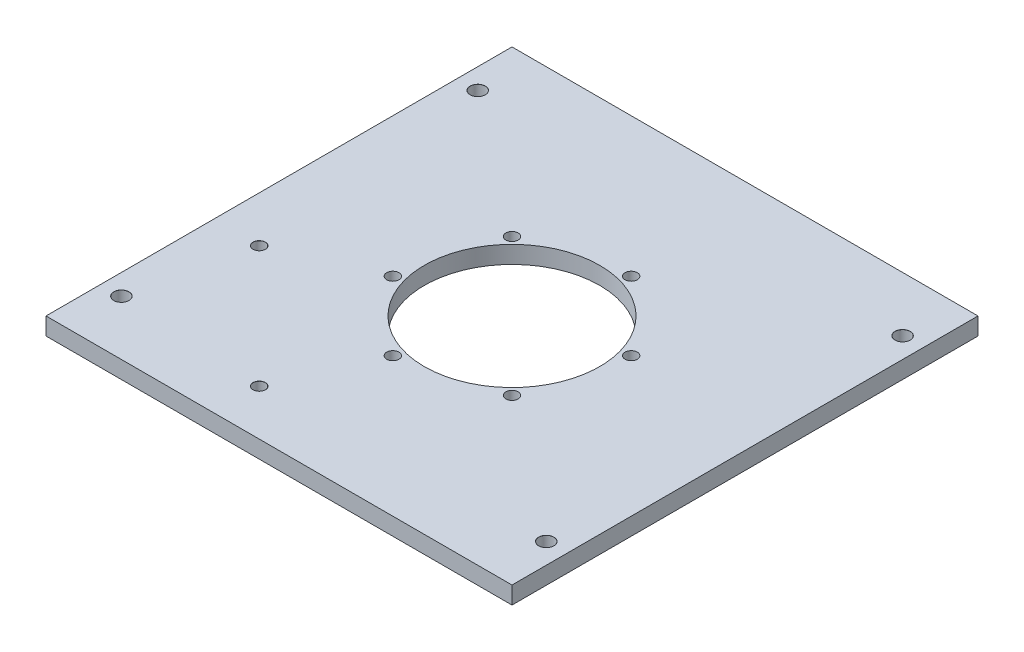
ISO-10303-21;
HEADER;
FILE_DESCRIPTION(('STEP AP214'),'2;1');
FILE_NAME('part.step','',(''),(''),'','','');
FILE_SCHEMA(('AUTOMOTIVE_DESIGN { 1 0 10303 214 1 1 1 1 }'));
ENDSEC;
DATA;
#1=APPLICATION_CONTEXT('core data for automotive mechanical design processes');
#2=APPLICATION_PROTOCOL_DEFINITION('international standard','automotive_design',2000,#1);
#3=PRODUCT_CONTEXT('',#1,'mechanical');
#4=PRODUCT('Part','Part','',(#3));
#5=PRODUCT_RELATED_PRODUCT_CATEGORY('part','',(#4));
#6=PRODUCT_DEFINITION_FORMATION('','',#4);
#7=PRODUCT_DEFINITION_CONTEXT('part definition',#1,'design');
#8=PRODUCT_DEFINITION('design','',#6,#7);
#9=PRODUCT_DEFINITION_SHAPE('','',#8);
#10=(LENGTH_UNIT() NAMED_UNIT(*) SI_UNIT(.MILLI.,.METRE.));
#11=(NAMED_UNIT(*) PLANE_ANGLE_UNIT() SI_UNIT($,.RADIAN.));
#12=(NAMED_UNIT(*) SI_UNIT($,.STERADIAN.) SOLID_ANGLE_UNIT());
#13=UNCERTAINTY_MEASURE_WITH_UNIT(LENGTH_MEASURE(1.E-05),#10,'distance_accuracy_value','');
#14=(GEOMETRIC_REPRESENTATION_CONTEXT(3) GLOBAL_UNCERTAINTY_ASSIGNED_CONTEXT((#13)) GLOBAL_UNIT_ASSIGNED_CONTEXT((#10,
#11,#12)) REPRESENTATION_CONTEXT('',''));
#15=CARTESIAN_POINT('',(0.,0.,0.));
#16=DIRECTION('',(0.,0.,1.));
#17=DIRECTION('',(1.,0.,0.));
#18=AXIS2_PLACEMENT_3D('',#15,#16,#17);
#19=CARTESIAN_POINT('',(0.,6.35,85.));
#20=DIRECTION('',(0.,0.,-1.));
#21=DIRECTION('',(-1.,0.,0.));
#22=AXIS2_PLACEMENT_3D('',#19,#20,#21);
#23=PLANE('',#22);
#24=DIRECTION('',(1.,0.,0.));
#25=VECTOR('',#24,1.);
#26=CARTESIAN_POINT('',(0.,0.,85.));
#27=LINE('',#26,#25);
#28=CARTESIAN_POINT('',(-85.,0.,85.));
#29=VERTEX_POINT('',#28);
#30=CARTESIAN_POINT('',(85.,0.,85.));
#31=VERTEX_POINT('',#30);
#32=EDGE_CURVE('E114',#29,#31,#27,.T.);
#33=ORIENTED_EDGE('',*,*,#32,.T.);
#34=DIRECTION('',(0.,-1.,0.));
#35=VECTOR('',#34,1.);
#36=CARTESIAN_POINT('',(85.,6.35,85.));
#37=LINE('',#36,#35);
#38=CARTESIAN_POINT('',(85.,6.35,85.));
#39=VERTEX_POINT('',#38);
#40=EDGE_CURVE('E11',#39,#31,#37,.T.);
#41=ORIENTED_EDGE('',*,*,#40,.F.);
#42=DIRECTION('',(1.,0.,0.));
#43=VECTOR('',#42,1.);
#44=CARTESIAN_POINT('',(0.,6.35,85.));
#45=LINE('',#44,#43);
#46=CARTESIAN_POINT('',(-85.,6.35,85.));
#47=VERTEX_POINT('',#46);
#48=EDGE_CURVE('E92',#47,#39,#45,.T.);
#49=ORIENTED_EDGE('',*,*,#48,.F.);
#50=DIRECTION('',(0.,-1.,0.));
#51=VECTOR('',#50,1.);
#52=CARTESIAN_POINT('',(-85.,6.35,85.));
#53=LINE('',#52,#51);
#54=EDGE_CURVE('E58',#47,#29,#53,.T.);
#55=ORIENTED_EDGE('',*,*,#54,.T.);
#56=EDGE_LOOP('',(#33,#41,#49,#55));
#57=FACE_BOUND('',#56,.T.);
#58=ADVANCED_FACE('F41',(#57),#23,.F.);
#59=CARTESIAN_POINT('',(85.,6.35,0.));
#60=DIRECTION('',(-1.,0.,0.));
#61=DIRECTION('',(0.,0.,1.));
#62=AXIS2_PLACEMENT_3D('',#59,#60,#61);
#63=PLANE('',#62);
#64=DIRECTION('',(0.,0.,-1.));
#65=VECTOR('',#64,1.);
#66=CARTESIAN_POINT('',(85.,0.,0.));
#67=LINE('',#66,#65);
#68=CARTESIAN_POINT('',(85.,0.,-85.));
#69=VERTEX_POINT('',#68);
#70=EDGE_CURVE('E98',#31,#69,#67,.T.);
#71=ORIENTED_EDGE('',*,*,#70,.T.);
#72=DIRECTION('',(0.,-1.,0.));
#73=VECTOR('',#72,1.);
#74=CARTESIAN_POINT('',(85.,6.35,-85.));
#75=LINE('',#74,#73);
#76=CARTESIAN_POINT('',(85.,6.35,-85.));
#77=VERTEX_POINT('',#76);
#78=EDGE_CURVE('E50',#77,#69,#75,.T.);
#79=ORIENTED_EDGE('',*,*,#78,.F.);
#80=DIRECTION('',(0.,0.,-1.));
#81=VECTOR('',#80,1.);
#82=CARTESIAN_POINT('',(85.,6.35,0.));
#83=LINE('',#82,#81);
#84=EDGE_CURVE('E83',#39,#77,#83,.T.);
#85=ORIENTED_EDGE('',*,*,#84,.F.);
#86=ORIENTED_EDGE('',*,*,#40,.T.);
#87=EDGE_LOOP('',(#71,#79,#85,#86));
#88=FACE_BOUND('',#87,.T.);
#89=ADVANCED_FACE('F97',(#88),#63,.F.);
#90=CARTESIAN_POINT('',(0.,6.35,-85.));
#91=DIRECTION('',(0.,0.,-1.));
#92=DIRECTION('',(-1.,0.,0.));
#93=AXIS2_PLACEMENT_3D('',#90,#91,#92);
#94=PLANE('',#93);
#95=DIRECTION('',(1.,0.,0.));
#96=VECTOR('',#95,1.);
#97=CARTESIAN_POINT('',(0.,0.,-85.));
#98=LINE('',#97,#96);
#99=CARTESIAN_POINT('',(-85.,0.,-85.));
#100=VERTEX_POINT('',#99);
#101=EDGE_CURVE('E120',#100,#69,#98,.T.);
#102=ORIENTED_EDGE('',*,*,#101,.F.);
#103=DIRECTION('',(0.,-1.,0.));
#104=VECTOR('',#103,1.);
#105=CARTESIAN_POINT('',(-85.,6.35,-85.));
#106=LINE('',#105,#104);
#107=CARTESIAN_POINT('',(-85.,6.35,-85.));
#108=VERTEX_POINT('',#107);
#109=EDGE_CURVE('E72',#108,#100,#106,.T.);
#110=ORIENTED_EDGE('',*,*,#109,.F.);
#111=DIRECTION('',(1.,0.,0.));
#112=VECTOR('',#111,1.);
#113=CARTESIAN_POINT('',(0.,6.35,-85.));
#114=LINE('',#113,#112);
#115=EDGE_CURVE('E91',#108,#77,#114,.T.);
#116=ORIENTED_EDGE('',*,*,#115,.T.);
#117=ORIENTED_EDGE('',*,*,#78,.T.);
#118=EDGE_LOOP('',(#102,#110,#116,#117));
#119=FACE_BOUND('',#118,.T.);
#120=ADVANCED_FACE('F102',(#119),#94,.T.);
#121=CARTESIAN_POINT('',(-85.,6.35,0.));
#122=DIRECTION('',(-1.,0.,0.));
#123=DIRECTION('',(0.,0.,1.));
#124=AXIS2_PLACEMENT_3D('',#121,#122,#123);
#125=PLANE('',#124);
#126=DIRECTION('',(0.,0.,-1.));
#127=VECTOR('',#126,1.);
#128=CARTESIAN_POINT('',(-85.,0.,0.));
#129=LINE('',#128,#127);
#130=EDGE_CURVE('E123',#29,#100,#129,.T.);
#131=ORIENTED_EDGE('',*,*,#130,.F.);
#132=ORIENTED_EDGE('',*,*,#54,.F.);
#133=DIRECTION('',(0.,0.,-1.));
#134=VECTOR('',#133,1.);
#135=CARTESIAN_POINT('',(-85.,6.35,0.));
#136=LINE('',#135,#134);
#137=EDGE_CURVE('E104',#47,#108,#136,.T.);
#138=ORIENTED_EDGE('',*,*,#137,.T.);
#139=ORIENTED_EDGE('',*,*,#109,.T.);
#140=EDGE_LOOP('',(#131,#132,#138,#139));
#141=FACE_BOUND('',#140,.T.);
#142=ADVANCED_FACE('F328',(#141),#125,.T.);
#143=CARTESIAN_POINT('',(0.,6.35,0.));
#144=DIRECTION('',(0.,-1.,0.));
#145=DIRECTION('',(0.,0.,-1.));
#146=AXIS2_PLACEMENT_3D('',#143,#144,#145);
#147=CYLINDRICAL_SURFACE('',#146,32.);
#148=CARTESIAN_POINT('',(0.,6.35,0.));
#149=DIRECTION('',(0.,1.,0.));
#150=DIRECTION('',(0.,0.,1.));
#151=AXIS2_PLACEMENT_3D('',#148,#149,#150);
#152=CIRCLE('',#151,32.);
#153=CARTESIAN_POINT('',(0.,6.35,32.));
#154=VERTEX_POINT('',#153);
#155=EDGE_CURVE('E107',#154,#154,#152,.T.);
#156=ORIENTED_EDGE('',*,*,#155,.T.);
#157=EDGE_LOOP('',(#156));
#158=FACE_BOUND('',#157,.T.);
#159=CARTESIAN_POINT('',(0.,0.,0.));
#160=DIRECTION('',(0.,1.,0.));
#161=DIRECTION('',(0.,0.,1.));
#162=AXIS2_PLACEMENT_3D('',#159,#160,#161);
#163=CIRCLE('',#162,32.);
#164=CARTESIAN_POINT('',(0.,0.,32.));
#165=VERTEX_POINT('',#164);
#166=EDGE_CURVE('E127',#165,#165,#163,.T.);
#167=ORIENTED_EDGE('',*,*,#166,.F.);
#168=EDGE_LOOP('',(#167));
#169=FACE_BOUND('',#168,.T.);
#170=ADVANCED_FACE('F287',(#158,#169),#147,.F.);
#171=CARTESIAN_POINT('',(0.,6.35,0.));
#172=DIRECTION('',(0.,1.,0.));
#173=DIRECTION('',(0.,0.,1.));
#174=AXIS2_PLACEMENT_3D('',#171,#172,#173);
#175=PLANE('',#174);
#176=CARTESIAN_POINT('',(-77.5,6.35,-65.));
#177=DIRECTION('',(0.,1.,0.));
#178=DIRECTION('',(0.,0.,1.));
#179=AXIS2_PLACEMENT_3D('',#176,#177,#178);
#180=CIRCLE('',#179,2.775);
#181=CARTESIAN_POINT('',(-77.5,6.35,-62.225));
#182=VERTEX_POINT('',#181);
#183=EDGE_CURVE('E277',#182,#182,#180,.T.);
#184=ORIENTED_EDGE('',*,*,#183,.F.);
#185=EDGE_LOOP('',(#184));
#186=FACE_BOUND('',#185,.T.);
#187=CARTESIAN_POINT('',(77.5,6.35,-65.));
#188=DIRECTION('',(0.,1.,0.));
#189=DIRECTION('',(0.,0.,1.));
#190=AXIS2_PLACEMENT_3D('',#187,#188,#189);
#191=CIRCLE('',#190,2.775);
#192=CARTESIAN_POINT('',(77.5,6.35,-62.225));
#193=VERTEX_POINT('',#192);
#194=EDGE_CURVE('E265',#193,#193,#191,.T.);
#195=ORIENTED_EDGE('',*,*,#194,.F.);
#196=EDGE_LOOP('',(#195));
#197=FACE_BOUND('',#196,.T.);
#198=CARTESIAN_POINT('',(77.5,6.35,65.));
#199=DIRECTION('',(0.,1.,0.));
#200=DIRECTION('',(0.,0.,1.));
#201=AXIS2_PLACEMENT_3D('',#198,#199,#200);
#202=CIRCLE('',#201,2.775);
#203=CARTESIAN_POINT('',(77.5,6.35,67.775));
#204=VERTEX_POINT('',#203);
#205=EDGE_CURVE('E253',#204,#204,#202,.T.);
#206=ORIENTED_EDGE('',*,*,#205,.F.);
#207=EDGE_LOOP('',(#206));
#208=FACE_BOUND('',#207,.T.);
#209=CARTESIAN_POINT('',(-77.5,6.35,65.));
#210=DIRECTION('',(0.,1.,0.));
#211=DIRECTION('',(0.,0.,1.));
#212=AXIS2_PLACEMENT_3D('',#209,#210,#211);
#213=CIRCLE('',#212,2.775);
#214=CARTESIAN_POINT('',(-77.5,6.35,67.775));
#215=VERTEX_POINT('',#214);
#216=EDGE_CURVE('E241',#215,#215,#213,.T.);
#217=ORIENTED_EDGE('',*,*,#216,.F.);
#218=EDGE_LOOP('',(#217));
#219=FACE_BOUND('',#218,.T.);
#220=CARTESIAN_POINT('',(-68.3016733622797,6.35,23.9165807072001));
#221=DIRECTION('',(0.,1.,0.));
#222=DIRECTION('',(0.,0.,1.));
#223=AXIS2_PLACEMENT_3D('',#220,#221,#222);
#224=CIRCLE('',#223,2.275);
#225=CARTESIAN_POINT('',(-68.3016733622797,6.35,26.1915807072001));
#226=VERTEX_POINT('',#225);
#227=EDGE_CURVE('E229',#226,#226,#224,.T.);
#228=ORIENTED_EDGE('',*,*,#227,.F.);
#229=EDGE_LOOP('',(#228));
#230=FACE_BOUND('',#229,.T.);
#231=CARTESIAN_POINT('',(-23.9165807072001,6.35,68.3016733622797));
#232=DIRECTION('',(0.,1.,0.));
#233=DIRECTION('',(0.,0.,1.));
#234=AXIS2_PLACEMENT_3D('',#231,#232,#233);
#235=CIRCLE('',#234,2.275);
#236=CARTESIAN_POINT('',(-23.9165807072001,6.35,70.5766733622797));
#237=VERTEX_POINT('',#236);
#238=EDGE_CURVE('E217',#237,#237,#235,.T.);
#239=ORIENTED_EDGE('',*,*,#238,.F.);
#240=EDGE_LOOP('',(#239));
#241=FACE_BOUND('',#240,.T.);
#242=CARTESIAN_POINT('',(9.18807610113908,6.35,-34.290366833262));
#243=DIRECTION('',(0.,-1.,0.));
#244=DIRECTION('',(0.,0.,-1.));
#245=AXIS2_PLACEMENT_3D('',#242,#243,#244);
#246=CIRCLE('',#245,2.25);
#247=CARTESIAN_POINT('',(9.18807610113908,6.35,-36.540366833262));
#248=VERTEX_POINT('',#247);
#249=EDGE_CURVE('E197',#248,#248,#246,.T.);
#250=ORIENTED_EDGE('',*,*,#249,.T.);
#251=EDGE_LOOP('',(#250));
#252=FACE_BOUND('',#251,.T.);
#253=CARTESIAN_POINT('',(-25.1022907321224,6.35,-25.1022907321224));
#254=DIRECTION('',(0.,-1.,0.));
#255=DIRECTION('',(0.,0.,-1.));
#256=AXIS2_PLACEMENT_3D('',#253,#254,#255);
#257=CIRCLE('',#256,2.25);
#258=CARTESIAN_POINT('',(-25.1022907321224,6.35,-27.3522907321224));
#259=VERTEX_POINT('',#258);
#260=EDGE_CURVE('E185',#259,#259,#257,.T.);
#261=ORIENTED_EDGE('',*,*,#260,.T.);
#262=EDGE_LOOP('',(#261));
#263=FACE_BOUND('',#262,.T.);
#264=CARTESIAN_POINT('',(-34.2903668332618,6.35,9.18807610114007));
#265=DIRECTION('',(0.,-1.,0.));
#266=DIRECTION('',(0.,0.,-1.));
#267=AXIS2_PLACEMENT_3D('',#264,#265,#266);
#268=CIRCLE('',#267,2.25);
#269=CARTESIAN_POINT('',(-34.2903668332618,6.35,6.93807610114007));
#270=VERTEX_POINT('',#269);
#271=EDGE_CURVE('E173',#270,#270,#268,.T.);
#272=ORIENTED_EDGE('',*,*,#271,.T.);
#273=EDGE_LOOP('',(#272));
#274=FACE_BOUND('',#273,.T.);
#275=CARTESIAN_POINT('',(-9.18807610113931,6.35,34.290366833262));
#276=DIRECTION('',(0.,-1.,0.));
#277=DIRECTION('',(0.,0.,-1.));
#278=AXIS2_PLACEMENT_3D('',#275,#276,#277);
#279=CIRCLE('',#278,2.25);
#280=CARTESIAN_POINT('',(-9.18807610113931,6.35,32.040366833262));
#281=VERTEX_POINT('',#280);
#282=EDGE_CURVE('E161',#281,#281,#279,.T.);
#283=ORIENTED_EDGE('',*,*,#282,.T.);
#284=EDGE_LOOP('',(#283));
#285=FACE_BOUND('',#284,.T.);
#286=CARTESIAN_POINT('',(25.1022907321224,6.35,25.1022907321224));
#287=DIRECTION('',(0.,-1.,0.));
#288=DIRECTION('',(0.,0.,-1.));
#289=AXIS2_PLACEMENT_3D('',#286,#287,#288);
#290=CIRCLE('',#289,2.25);
#291=CARTESIAN_POINT('',(25.1022907321224,6.35,22.8522907321224));
#292=VERTEX_POINT('',#291);
#293=EDGE_CURVE('E149',#292,#292,#290,.T.);
#294=ORIENTED_EDGE('',*,*,#293,.T.);
#295=EDGE_LOOP('',(#294));
#296=FACE_BOUND('',#295,.T.);
#297=CARTESIAN_POINT('',(34.2903668332619,6.35,-9.18807610113958));
#298=DIRECTION('',(0.,-1.,0.));
#299=DIRECTION('',(0.,0.,-1.));
#300=AXIS2_PLACEMENT_3D('',#297,#298,#299);
#301=CIRCLE('',#300,2.25);
#302=CARTESIAN_POINT('',(34.2903668332619,6.35,-11.4380761011396));
#303=VERTEX_POINT('',#302);
#304=EDGE_CURVE('E117',#303,#303,#301,.T.);
#305=ORIENTED_EDGE('',*,*,#304,.T.);
#306=EDGE_LOOP('',(#305));
#307=FACE_BOUND('',#306,.T.);
#308=ORIENTED_EDGE('',*,*,#48,.T.);
#309=ORIENTED_EDGE('',*,*,#84,.T.);
#310=ORIENTED_EDGE('',*,*,#115,.F.);
#311=ORIENTED_EDGE('',*,*,#137,.F.);
#312=EDGE_LOOP('',(#308,#309,#310,#311));
#313=FACE_BOUND('',#312,.T.);
#314=ORIENTED_EDGE('',*,*,#155,.F.);
#315=EDGE_LOOP('',(#314));
#316=FACE_BOUND('',#315,.T.);
#317=ADVANCED_FACE('F87',(#186,#197,#208,#219,#230,#241,#252,#263,#274,#285,#296,#307,#313,
#316),#175,.T.);
#318=CARTESIAN_POINT('',(0.,0.,0.));
#319=DIRECTION('',(0.,1.,0.));
#320=DIRECTION('',(0.,0.,1.));
#321=AXIS2_PLACEMENT_3D('',#318,#319,#320);
#322=PLANE('',#321);
#323=CARTESIAN_POINT('',(-77.5,0.,-65.));
#324=DIRECTION('',(0.,1.,0.));
#325=DIRECTION('',(0.,0.,1.));
#326=AXIS2_PLACEMENT_3D('',#323,#324,#325);
#327=CIRCLE('',#326,2.75);
#328=CARTESIAN_POINT('',(-77.5,0.,-62.25));
#329=VERTEX_POINT('',#328);
#330=EDGE_CURVE('E269',#329,#329,#327,.T.);
#331=ORIENTED_EDGE('',*,*,#330,.T.);
#332=EDGE_LOOP('',(#331));
#333=FACE_BOUND('',#332,.T.);
#334=CARTESIAN_POINT('',(77.5,0.,-65.));
#335=DIRECTION('',(0.,1.,0.));
#336=DIRECTION('',(0.,0.,1.));
#337=AXIS2_PLACEMENT_3D('',#334,#335,#336);
#338=CIRCLE('',#337,2.75);
#339=CARTESIAN_POINT('',(77.5,0.,-62.25));
#340=VERTEX_POINT('',#339);
#341=EDGE_CURVE('E257',#340,#340,#338,.T.);
#342=ORIENTED_EDGE('',*,*,#341,.T.);
#343=EDGE_LOOP('',(#342));
#344=FACE_BOUND('',#343,.T.);
#345=CARTESIAN_POINT('',(77.5,0.,65.));
#346=DIRECTION('',(0.,1.,0.));
#347=DIRECTION('',(0.,0.,1.));
#348=AXIS2_PLACEMENT_3D('',#345,#346,#347);
#349=CIRCLE('',#348,2.75);
#350=CARTESIAN_POINT('',(77.5,0.,67.75));
#351=VERTEX_POINT('',#350);
#352=EDGE_CURVE('E245',#351,#351,#349,.T.);
#353=ORIENTED_EDGE('',*,*,#352,.T.);
#354=EDGE_LOOP('',(#353));
#355=FACE_BOUND('',#354,.T.);
#356=CARTESIAN_POINT('',(-77.5,0.,65.));
#357=DIRECTION('',(0.,1.,0.));
#358=DIRECTION('',(0.,0.,1.));
#359=AXIS2_PLACEMENT_3D('',#356,#357,#358);
#360=CIRCLE('',#359,2.75);
#361=CARTESIAN_POINT('',(-77.5,0.,67.75));
#362=VERTEX_POINT('',#361);
#363=EDGE_CURVE('E233',#362,#362,#360,.T.);
#364=ORIENTED_EDGE('',*,*,#363,.T.);
#365=EDGE_LOOP('',(#364));
#366=FACE_BOUND('',#365,.T.);
#367=CARTESIAN_POINT('',(-68.3016733622797,0.,23.9165807072001));
#368=DIRECTION('',(0.,1.,0.));
#369=DIRECTION('',(0.,0.,1.));
#370=AXIS2_PLACEMENT_3D('',#367,#368,#369);
#371=CIRCLE('',#370,2.25);
#372=CARTESIAN_POINT('',(-68.3016733622797,0.,26.1665807072001));
#373=VERTEX_POINT('',#372);
#374=EDGE_CURVE('E221',#373,#373,#371,.T.);
#375=ORIENTED_EDGE('',*,*,#374,.T.);
#376=EDGE_LOOP('',(#375));
#377=FACE_BOUND('',#376,.T.);
#378=CARTESIAN_POINT('',(-23.9165807072001,0.,68.3016733622797));
#379=DIRECTION('',(0.,1.,0.));
#380=DIRECTION('',(0.,0.,1.));
#381=AXIS2_PLACEMENT_3D('',#378,#379,#380);
#382=CIRCLE('',#381,2.25);
#383=CARTESIAN_POINT('',(-23.9165807072001,0.,70.5516733622797));
#384=VERTEX_POINT('',#383);
#385=EDGE_CURVE('E209',#384,#384,#382,.T.);
#386=ORIENTED_EDGE('',*,*,#385,.T.);
#387=EDGE_LOOP('',(#386));
#388=FACE_BOUND('',#387,.T.);
#389=CARTESIAN_POINT('',(9.18807610113908,0.,-34.290366833262));
#390=DIRECTION('',(0.,-1.,0.));
#391=DIRECTION('',(0.,0.,-1.));
#392=AXIS2_PLACEMENT_3D('',#389,#390,#391);
#393=CIRCLE('',#392,2.275);
#394=CARTESIAN_POINT('',(9.18807610113908,0.,-36.565366833262));
#395=VERTEX_POINT('',#394);
#396=EDGE_CURVE('E205',#395,#395,#393,.T.);
#397=ORIENTED_EDGE('',*,*,#396,.F.);
#398=EDGE_LOOP('',(#397));
#399=FACE_BOUND('',#398,.T.);
#400=CARTESIAN_POINT('',(-25.1022907321224,0.,-25.1022907321224));
#401=DIRECTION('',(0.,-1.,0.));
#402=DIRECTION('',(0.,0.,-1.));
#403=AXIS2_PLACEMENT_3D('',#400,#401,#402);
#404=CIRCLE('',#403,2.275);
#405=CARTESIAN_POINT('',(-25.1022907321224,0.,-27.3772907321224));
#406=VERTEX_POINT('',#405);
#407=EDGE_CURVE('E193',#406,#406,#404,.T.);
#408=ORIENTED_EDGE('',*,*,#407,.F.);
#409=EDGE_LOOP('',(#408));
#410=FACE_BOUND('',#409,.T.);
#411=CARTESIAN_POINT('',(-34.2903668332618,0.,9.18807610114007));
#412=DIRECTION('',(0.,-1.,0.));
#413=DIRECTION('',(0.,0.,-1.));
#414=AXIS2_PLACEMENT_3D('',#411,#412,#413);
#415=CIRCLE('',#414,2.275);
#416=CARTESIAN_POINT('',(-34.2903668332618,0.,6.91307610114007));
#417=VERTEX_POINT('',#416);
#418=EDGE_CURVE('E181',#417,#417,#415,.T.);
#419=ORIENTED_EDGE('',*,*,#418,.F.);
#420=EDGE_LOOP('',(#419));
#421=FACE_BOUND('',#420,.T.);
#422=CARTESIAN_POINT('',(-9.18807610113931,0.,34.290366833262));
#423=DIRECTION('',(0.,-1.,0.));
#424=DIRECTION('',(0.,0.,-1.));
#425=AXIS2_PLACEMENT_3D('',#422,#423,#424);
#426=CIRCLE('',#425,2.275);
#427=CARTESIAN_POINT('',(-9.18807610113931,0.,32.015366833262));
#428=VERTEX_POINT('',#427);
#429=EDGE_CURVE('E169',#428,#428,#426,.T.);
#430=ORIENTED_EDGE('',*,*,#429,.F.);
#431=EDGE_LOOP('',(#430));
#432=FACE_BOUND('',#431,.T.);
#433=CARTESIAN_POINT('',(25.1022907321224,0.,25.1022907321224));
#434=DIRECTION('',(0.,-1.,0.));
#435=DIRECTION('',(0.,0.,-1.));
#436=AXIS2_PLACEMENT_3D('',#433,#434,#435);
#437=CIRCLE('',#436,2.275);
#438=CARTESIAN_POINT('',(25.1022907321224,0.,22.8272907321224));
#439=VERTEX_POINT('',#438);
#440=EDGE_CURVE('E157',#439,#439,#437,.T.);
#441=ORIENTED_EDGE('',*,*,#440,.F.);
#442=EDGE_LOOP('',(#441));
#443=FACE_BOUND('',#442,.T.);
#444=CARTESIAN_POINT('',(34.2903668332619,0.,-9.18807610113958));
#445=DIRECTION('',(0.,-1.,0.));
#446=DIRECTION('',(0.,0.,-1.));
#447=AXIS2_PLACEMENT_3D('',#444,#445,#446);
#448=CIRCLE('',#447,2.275);
#449=CARTESIAN_POINT('',(34.2903668332619,0.,-11.4630761011396));
#450=VERTEX_POINT('',#449);
#451=EDGE_CURVE('E145',#450,#450,#448,.T.);
#452=ORIENTED_EDGE('',*,*,#451,.F.);
#453=EDGE_LOOP('',(#452));
#454=FACE_BOUND('',#453,.T.);
#455=ORIENTED_EDGE('',*,*,#32,.F.);
#456=ORIENTED_EDGE('',*,*,#130,.T.);
#457=ORIENTED_EDGE('',*,*,#101,.T.);
#458=ORIENTED_EDGE('',*,*,#70,.F.);
#459=EDGE_LOOP('',(#455,#456,#457,#458));
#460=FACE_BOUND('',#459,.T.);
#461=ORIENTED_EDGE('',*,*,#166,.T.);
#462=EDGE_LOOP('',(#461));
#463=FACE_BOUND('',#462,.T.);
#464=ADVANCED_FACE('F286',(#333,#344,#355,#366,#377,#388,#399,#410,#421,#432,#443,#454,#460,
#463),#322,.F.);
#465=CARTESIAN_POINT('',(34.2903668332619,0.,-9.18807610113958));
#466=DIRECTION('',(0.,-1.,0.));
#467=DIRECTION('',(0.,0.,-1.));
#468=AXIS2_PLACEMENT_3D('',#465,#466,#467);
#469=CYLINDRICAL_SURFACE('',#468,2.25);
#470=ORIENTED_EDGE('',*,*,#304,.F.);
#471=EDGE_LOOP('',(#470));
#472=FACE_BOUND('',#471,.T.);
#473=CARTESIAN_POINT('',(34.2903668332619,0.0249999999999972,-9.18807610113958));
#474=DIRECTION('',(0.,-1.,0.));
#475=DIRECTION('',(0.,0.,-1.));
#476=AXIS2_PLACEMENT_3D('',#473,#474,#475);
#477=CIRCLE('',#476,2.24999999999999);
#478=CARTESIAN_POINT('',(34.2903668332619,0.0249999999999972,-11.4380761011396));
#479=VERTEX_POINT('',#478);
#480=EDGE_CURVE('E141',#479,#479,#477,.T.);
#481=ORIENTED_EDGE('',*,*,#480,.T.);
#482=EDGE_LOOP('',(#481));
#483=FACE_BOUND('',#482,.T.);
#484=ADVANCED_FACE('F311',(#472,#483),#469,.F.);
#485=CARTESIAN_POINT('',(34.2903668332619,0.,-9.18807610113958));
#486=DIRECTION('',(0.,-1.,0.));
#487=DIRECTION('',(0.,0.,-1.));
#488=AXIS2_PLACEMENT_3D('',#485,#486,#487);
#489=CONICAL_SURFACE('',#488,2.275,0.785398163397691);
#490=ORIENTED_EDGE('',*,*,#480,.F.);
#491=EDGE_LOOP('',(#490));
#492=FACE_BOUND('',#491,.T.);
#493=ORIENTED_EDGE('',*,*,#451,.T.);
#494=EDGE_LOOP('',(#493));
#495=FACE_BOUND('',#494,.T.);
#496=ADVANCED_FACE('F314',(#492,#495),#489,.F.);
#497=CARTESIAN_POINT('',(25.1022907321224,0.,25.1022907321224));
#498=DIRECTION('',(0.,-1.,0.));
#499=DIRECTION('',(0.,0.,-1.));
#500=AXIS2_PLACEMENT_3D('',#497,#498,#499);
#501=CYLINDRICAL_SURFACE('',#500,2.24999999999999);
#502=ORIENTED_EDGE('',*,*,#293,.F.);
#503=EDGE_LOOP('',(#502));
#504=FACE_BOUND('',#503,.T.);
#505=CARTESIAN_POINT('',(25.1022907321224,0.0249999999999972,25.1022907321224));
#506=DIRECTION('',(0.,-1.,0.));
#507=DIRECTION('',(0.,0.,-1.));
#508=AXIS2_PLACEMENT_3D('',#505,#506,#507);
#509=CIRCLE('',#508,2.24999999999999);
#510=CARTESIAN_POINT('',(25.1022907321224,0.0249999999999972,22.8522907321224));
#511=VERTEX_POINT('',#510);
#512=EDGE_CURVE('E153',#511,#511,#509,.T.);
#513=ORIENTED_EDGE('',*,*,#512,.T.);
#514=EDGE_LOOP('',(#513));
#515=FACE_BOUND('',#514,.T.);
#516=ADVANCED_FACE('F320',(#504,#515),#501,.F.);
#517=CARTESIAN_POINT('',(25.1022907321224,0.,25.1022907321224));
#518=DIRECTION('',(0.,-1.,0.));
#519=DIRECTION('',(0.,0.,-1.));
#520=AXIS2_PLACEMENT_3D('',#517,#518,#519);
#521=CONICAL_SURFACE('',#520,2.275,0.785398163397691);
#522=ORIENTED_EDGE('',*,*,#512,.F.);
#523=EDGE_LOOP('',(#522));
#524=FACE_BOUND('',#523,.T.);
#525=ORIENTED_EDGE('',*,*,#440,.T.);
#526=EDGE_LOOP('',(#525));
#527=FACE_BOUND('',#526,.T.);
#528=ADVANCED_FACE('F381',(#524,#527),#521,.F.);
#529=CARTESIAN_POINT('',(-9.18807610113931,0.,34.290366833262));
#530=DIRECTION('',(0.,-1.,0.));
#531=DIRECTION('',(0.,0.,-1.));
#532=AXIS2_PLACEMENT_3D('',#529,#530,#531);
#533=CYLINDRICAL_SURFACE('',#532,2.24999999999999);
#534=ORIENTED_EDGE('',*,*,#282,.F.);
#535=EDGE_LOOP('',(#534));
#536=FACE_BOUND('',#535,.T.);
#537=CARTESIAN_POINT('',(-9.18807610113931,0.0249999999999972,34.290366833262));
#538=DIRECTION('',(0.,-1.,0.));
#539=DIRECTION('',(0.,0.,-1.));
#540=AXIS2_PLACEMENT_3D('',#537,#538,#539);
#541=CIRCLE('',#540,2.24999999999999);
#542=CARTESIAN_POINT('',(-9.18807610113931,0.0249999999999972,32.040366833262));
#543=VERTEX_POINT('',#542);
#544=EDGE_CURVE('E165',#543,#543,#541,.T.);
#545=ORIENTED_EDGE('',*,*,#544,.T.);
#546=EDGE_LOOP('',(#545));
#547=FACE_BOUND('',#546,.T.);
#548=ADVANCED_FACE('F391',(#536,#547),#533,.F.);
#549=CARTESIAN_POINT('',(-9.18807610113931,0.,34.290366833262));
#550=DIRECTION('',(0.,-1.,0.));
#551=DIRECTION('',(0.,0.,-1.));
#552=AXIS2_PLACEMENT_3D('',#549,#550,#551);
#553=CONICAL_SURFACE('',#552,2.275,0.785398163397691);
#554=ORIENTED_EDGE('',*,*,#544,.F.);
#555=EDGE_LOOP('',(#554));
#556=FACE_BOUND('',#555,.T.);
#557=ORIENTED_EDGE('',*,*,#429,.T.);
#558=EDGE_LOOP('',(#557));
#559=FACE_BOUND('',#558,.T.);
#560=ADVANCED_FACE('F401',(#556,#559),#553,.F.);
#561=CARTESIAN_POINT('',(-34.2903668332618,0.,9.18807610114007));
#562=DIRECTION('',(0.,-1.,0.));
#563=DIRECTION('',(0.,0.,-1.));
#564=AXIS2_PLACEMENT_3D('',#561,#562,#563);
#565=CYLINDRICAL_SURFACE('',#564,2.25);
#566=ORIENTED_EDGE('',*,*,#271,.F.);
#567=EDGE_LOOP('',(#566));
#568=FACE_BOUND('',#567,.T.);
#569=CARTESIAN_POINT('',(-34.2903668332618,0.0249999999999972,9.18807610114007));
#570=DIRECTION('',(0.,-1.,0.));
#571=DIRECTION('',(0.,0.,-1.));
#572=AXIS2_PLACEMENT_3D('',#569,#570,#571);
#573=CIRCLE('',#572,2.24999999999999);
#574=CARTESIAN_POINT('',(-34.2903668332618,0.0249999999999972,6.93807610114008));
#575=VERTEX_POINT('',#574);
#576=EDGE_CURVE('E177',#575,#575,#573,.T.);
#577=ORIENTED_EDGE('',*,*,#576,.T.);
#578=EDGE_LOOP('',(#577));
#579=FACE_BOUND('',#578,.T.);
#580=ADVANCED_FACE('F411',(#568,#579),#565,.F.);
#581=CARTESIAN_POINT('',(-34.2903668332618,0.,9.18807610114007));
#582=DIRECTION('',(0.,-1.,0.));
#583=DIRECTION('',(0.,0.,-1.));
#584=AXIS2_PLACEMENT_3D('',#581,#582,#583);
#585=CONICAL_SURFACE('',#584,2.275,0.785398163397691);
#586=ORIENTED_EDGE('',*,*,#576,.F.);
#587=EDGE_LOOP('',(#586));
#588=FACE_BOUND('',#587,.T.);
#589=ORIENTED_EDGE('',*,*,#418,.T.);
#590=EDGE_LOOP('',(#589));
#591=FACE_BOUND('',#590,.T.);
#592=ADVANCED_FACE('F421',(#588,#591),#585,.F.);
#593=CARTESIAN_POINT('',(-25.1022907321224,0.,-25.1022907321224));
#594=DIRECTION('',(0.,-1.,0.));
#595=DIRECTION('',(0.,0.,-1.));
#596=AXIS2_PLACEMENT_3D('',#593,#594,#595);
#597=CYLINDRICAL_SURFACE('',#596,2.24999999999999);
#598=ORIENTED_EDGE('',*,*,#260,.F.);
#599=EDGE_LOOP('',(#598));
#600=FACE_BOUND('',#599,.T.);
#601=CARTESIAN_POINT('',(-25.1022907321224,0.0249999999999972,-25.1022907321224));
#602=DIRECTION('',(0.,-1.,0.));
#603=DIRECTION('',(0.,0.,-1.));
#604=AXIS2_PLACEMENT_3D('',#601,#602,#603);
#605=CIRCLE('',#604,2.24999999999999);
#606=CARTESIAN_POINT('',(-25.1022907321224,0.0249999999999972,-27.3522907321224));
#607=VERTEX_POINT('',#606);
#608=EDGE_CURVE('E189',#607,#607,#605,.T.);
#609=ORIENTED_EDGE('',*,*,#608,.T.);
#610=EDGE_LOOP('',(#609));
#611=FACE_BOUND('',#610,.T.);
#612=ADVANCED_FACE('F431',(#600,#611),#597,.F.);
#613=CARTESIAN_POINT('',(-25.1022907321224,0.,-25.1022907321224));
#614=DIRECTION('',(0.,-1.,0.));
#615=DIRECTION('',(0.,0.,-1.));
#616=AXIS2_PLACEMENT_3D('',#613,#614,#615);
#617=CONICAL_SURFACE('',#616,2.275,0.785398163397691);
#618=ORIENTED_EDGE('',*,*,#608,.F.);
#619=EDGE_LOOP('',(#618));
#620=FACE_BOUND('',#619,.T.);
#621=ORIENTED_EDGE('',*,*,#407,.T.);
#622=EDGE_LOOP('',(#621));
#623=FACE_BOUND('',#622,.T.);
#624=ADVANCED_FACE('F441',(#620,#623),#617,.F.);
#625=CARTESIAN_POINT('',(9.18807610113908,0.,-34.290366833262));
#626=DIRECTION('',(0.,-1.,0.));
#627=DIRECTION('',(0.,0.,-1.));
#628=AXIS2_PLACEMENT_3D('',#625,#626,#627);
#629=CYLINDRICAL_SURFACE('',#628,2.24999999999999);
#630=ORIENTED_EDGE('',*,*,#249,.F.);
#631=EDGE_LOOP('',(#630));
#632=FACE_BOUND('',#631,.T.);
#633=CARTESIAN_POINT('',(9.18807610113908,0.0249999999999972,-34.290366833262));
#634=DIRECTION('',(0.,-1.,0.));
#635=DIRECTION('',(0.,0.,-1.));
#636=AXIS2_PLACEMENT_3D('',#633,#634,#635);
#637=CIRCLE('',#636,2.24999999999999);
#638=CARTESIAN_POINT('',(9.18807610113908,0.0249999999999972,-36.540366833262));
#639=VERTEX_POINT('',#638);
#640=EDGE_CURVE('E201',#639,#639,#637,.T.);
#641=ORIENTED_EDGE('',*,*,#640,.T.);
#642=EDGE_LOOP('',(#641));
#643=FACE_BOUND('',#642,.T.);
#644=ADVANCED_FACE('F451',(#632,#643),#629,.F.);
#645=CARTESIAN_POINT('',(9.18807610113908,0.,-34.290366833262));
#646=DIRECTION('',(0.,-1.,0.));
#647=DIRECTION('',(0.,0.,-1.));
#648=AXIS2_PLACEMENT_3D('',#645,#646,#647);
#649=CONICAL_SURFACE('',#648,2.275,0.785398163397691);
#650=ORIENTED_EDGE('',*,*,#640,.F.);
#651=EDGE_LOOP('',(#650));
#652=FACE_BOUND('',#651,.T.);
#653=ORIENTED_EDGE('',*,*,#396,.T.);
#654=EDGE_LOOP('',(#653));
#655=FACE_BOUND('',#654,.T.);
#656=ADVANCED_FACE('F461',(#652,#655),#649,.F.);
#657=CARTESIAN_POINT('',(-23.9165807072001,6.35,68.3016733622797));
#658=DIRECTION('',(0.,1.,0.));
#659=DIRECTION('',(0.,0.,1.));
#660=AXIS2_PLACEMENT_3D('',#657,#658,#659);
#661=CYLINDRICAL_SURFACE('',#660,2.24999999999999);
#662=ORIENTED_EDGE('',*,*,#385,.F.);
#663=EDGE_LOOP('',(#662));
#664=FACE_BOUND('',#663,.T.);
#665=CARTESIAN_POINT('',(-23.9165807072001,6.325,68.3016733622797));
#666=DIRECTION('',(0.,1.,0.));
#667=DIRECTION('',(0.,0.,1.));
#668=AXIS2_PLACEMENT_3D('',#665,#666,#667);
#669=CIRCLE('',#668,2.24999999999999);
#670=CARTESIAN_POINT('',(-23.9165807072001,6.325,70.5516733622797));
#671=VERTEX_POINT('',#670);
#672=EDGE_CURVE('E213',#671,#671,#669,.T.);
#673=ORIENTED_EDGE('',*,*,#672,.T.);
#674=EDGE_LOOP('',(#673));
#675=FACE_BOUND('',#674,.T.);
#676=ADVANCED_FACE('F471',(#664,#675),#661,.F.);
#677=CARTESIAN_POINT('',(-23.9165807072001,6.35,68.3016733622797));
#678=DIRECTION('',(0.,1.,0.));
#679=DIRECTION('',(0.,0.,1.));
#680=AXIS2_PLACEMENT_3D('',#677,#678,#679);
#681=CONICAL_SURFACE('',#680,2.275,0.785398163397691);
#682=ORIENTED_EDGE('',*,*,#672,.F.);
#683=EDGE_LOOP('',(#682));
#684=FACE_BOUND('',#683,.T.);
#685=ORIENTED_EDGE('',*,*,#238,.T.);
#686=EDGE_LOOP('',(#685));
#687=FACE_BOUND('',#686,.T.);
#688=ADVANCED_FACE('F481',(#684,#687),#681,.F.);
#689=CARTESIAN_POINT('',(-68.3016733622797,6.35,23.9165807072001));
#690=DIRECTION('',(0.,1.,0.));
#691=DIRECTION('',(0.,0.,1.));
#692=AXIS2_PLACEMENT_3D('',#689,#690,#691);
#693=CYLINDRICAL_SURFACE('',#692,2.25);
#694=ORIENTED_EDGE('',*,*,#374,.F.);
#695=EDGE_LOOP('',(#694));
#696=FACE_BOUND('',#695,.T.);
#697=CARTESIAN_POINT('',(-68.3016733622797,6.325,23.9165807072001));
#698=DIRECTION('',(0.,1.,0.));
#699=DIRECTION('',(0.,0.,1.));
#700=AXIS2_PLACEMENT_3D('',#697,#698,#699);
#701=CIRCLE('',#700,2.24999999999999);
#702=CARTESIAN_POINT('',(-68.3016733622797,6.325,26.1665807072001));
#703=VERTEX_POINT('',#702);
#704=EDGE_CURVE('E225',#703,#703,#701,.T.);
#705=ORIENTED_EDGE('',*,*,#704,.T.);
#706=EDGE_LOOP('',(#705));
#707=FACE_BOUND('',#706,.T.);
#708=ADVANCED_FACE('F491',(#696,#707),#693,.F.);
#709=CARTESIAN_POINT('',(-68.3016733622797,6.35,23.9165807072001));
#710=DIRECTION('',(0.,1.,0.));
#711=DIRECTION('',(0.,0.,1.));
#712=AXIS2_PLACEMENT_3D('',#709,#710,#711);
#713=CONICAL_SURFACE('',#712,2.275,0.785398163397691);
#714=ORIENTED_EDGE('',*,*,#704,.F.);
#715=EDGE_LOOP('',(#714));
#716=FACE_BOUND('',#715,.T.);
#717=ORIENTED_EDGE('',*,*,#227,.T.);
#718=EDGE_LOOP('',(#717));
#719=FACE_BOUND('',#718,.T.);
#720=ADVANCED_FACE('F501',(#716,#719),#713,.F.);
#721=CARTESIAN_POINT('',(-77.5,6.35,65.));
#722=DIRECTION('',(0.,1.,0.));
#723=DIRECTION('',(0.,0.,1.));
#724=AXIS2_PLACEMENT_3D('',#721,#722,#723);
#725=CYLINDRICAL_SURFACE('',#724,2.75);
#726=ORIENTED_EDGE('',*,*,#363,.F.);
#727=EDGE_LOOP('',(#726));
#728=FACE_BOUND('',#727,.T.);
#729=CARTESIAN_POINT('',(-77.5,6.325,65.));
#730=DIRECTION('',(0.,1.,0.));
#731=DIRECTION('',(0.,0.,1.));
#732=AXIS2_PLACEMENT_3D('',#729,#730,#731);
#733=CIRCLE('',#732,2.74999999999999);
#734=CARTESIAN_POINT('',(-77.5,6.325,67.75));
#735=VERTEX_POINT('',#734);
#736=EDGE_CURVE('E237',#735,#735,#733,.T.);
#737=ORIENTED_EDGE('',*,*,#736,.T.);
#738=EDGE_LOOP('',(#737));
#739=FACE_BOUND('',#738,.T.);
#740=ADVANCED_FACE('F511',(#728,#739),#725,.F.);
#741=CARTESIAN_POINT('',(-77.5,6.35,65.));
#742=DIRECTION('',(0.,1.,0.));
#743=DIRECTION('',(0.,0.,1.));
#744=AXIS2_PLACEMENT_3D('',#741,#742,#743);
#745=CONICAL_SURFACE('',#744,2.775,0.785398163397691);
#746=ORIENTED_EDGE('',*,*,#736,.F.);
#747=EDGE_LOOP('',(#746));
#748=FACE_BOUND('',#747,.T.);
#749=ORIENTED_EDGE('',*,*,#216,.T.);
#750=EDGE_LOOP('',(#749));
#751=FACE_BOUND('',#750,.T.);
#752=ADVANCED_FACE('F533',(#748,#751),#745,.F.);
#753=CARTESIAN_POINT('',(77.5,6.35,65.));
#754=DIRECTION('',(0.,1.,0.));
#755=DIRECTION('',(0.,0.,1.));
#756=AXIS2_PLACEMENT_3D('',#753,#754,#755);
#757=CYLINDRICAL_SURFACE('',#756,2.75);
#758=ORIENTED_EDGE('',*,*,#352,.F.);
#759=EDGE_LOOP('',(#758));
#760=FACE_BOUND('',#759,.T.);
#761=CARTESIAN_POINT('',(77.5,6.325,65.));
#762=DIRECTION('',(0.,1.,0.));
#763=DIRECTION('',(0.,0.,1.));
#764=AXIS2_PLACEMENT_3D('',#761,#762,#763);
#765=CIRCLE('',#764,2.74999999999999);
#766=CARTESIAN_POINT('',(77.5,6.325,67.75));
#767=VERTEX_POINT('',#766);
#768=EDGE_CURVE('E249',#767,#767,#765,.T.);
#769=ORIENTED_EDGE('',*,*,#768,.T.);
#770=EDGE_LOOP('',(#769));
#771=FACE_BOUND('',#770,.T.);
#772=ADVANCED_FACE('F543',(#760,#771),#757,.F.);
#773=CARTESIAN_POINT('',(77.5,6.35,65.));
#774=DIRECTION('',(0.,1.,0.));
#775=DIRECTION('',(0.,0.,1.));
#776=AXIS2_PLACEMENT_3D('',#773,#774,#775);
#777=CONICAL_SURFACE('',#776,2.775,0.785398163397691);
#778=ORIENTED_EDGE('',*,*,#768,.F.);
#779=EDGE_LOOP('',(#778));
#780=FACE_BOUND('',#779,.T.);
#781=ORIENTED_EDGE('',*,*,#205,.T.);
#782=EDGE_LOOP('',(#781));
#783=FACE_BOUND('',#782,.T.);
#784=ADVANCED_FACE('F553',(#780,#783),#777,.F.);
#785=CARTESIAN_POINT('',(77.5,6.35,-65.));
#786=DIRECTION('',(0.,1.,0.));
#787=DIRECTION('',(0.,0.,1.));
#788=AXIS2_PLACEMENT_3D('',#785,#786,#787);
#789=CYLINDRICAL_SURFACE('',#788,2.75);
#790=ORIENTED_EDGE('',*,*,#341,.F.);
#791=EDGE_LOOP('',(#790));
#792=FACE_BOUND('',#791,.T.);
#793=CARTESIAN_POINT('',(77.5,6.325,-65.));
#794=DIRECTION('',(0.,1.,0.));
#795=DIRECTION('',(0.,0.,1.));
#796=AXIS2_PLACEMENT_3D('',#793,#794,#795);
#797=CIRCLE('',#796,2.74999999999999);
#798=CARTESIAN_POINT('',(77.5,6.325,-62.25));
#799=VERTEX_POINT('',#798);
#800=EDGE_CURVE('E261',#799,#799,#797,.T.);
#801=ORIENTED_EDGE('',*,*,#800,.T.);
#802=EDGE_LOOP('',(#801));
#803=FACE_BOUND('',#802,.T.);
#804=ADVANCED_FACE('F563',(#792,#803),#789,.F.);
#805=CARTESIAN_POINT('',(77.5,6.35,-65.));
#806=DIRECTION('',(0.,1.,0.));
#807=DIRECTION('',(0.,0.,1.));
#808=AXIS2_PLACEMENT_3D('',#805,#806,#807);
#809=CONICAL_SURFACE('',#808,2.775,0.785398163397691);
#810=ORIENTED_EDGE('',*,*,#800,.F.);
#811=EDGE_LOOP('',(#810));
#812=FACE_BOUND('',#811,.T.);
#813=ORIENTED_EDGE('',*,*,#194,.T.);
#814=EDGE_LOOP('',(#813));
#815=FACE_BOUND('',#814,.T.);
#816=ADVANCED_FACE('F573',(#812,#815),#809,.F.);
#817=CARTESIAN_POINT('',(-77.5,6.35,-65.));
#818=DIRECTION('',(0.,1.,0.));
#819=DIRECTION('',(0.,0.,1.));
#820=AXIS2_PLACEMENT_3D('',#817,#818,#819);
#821=CYLINDRICAL_SURFACE('',#820,2.75);
#822=ORIENTED_EDGE('',*,*,#330,.F.);
#823=EDGE_LOOP('',(#822));
#824=FACE_BOUND('',#823,.T.);
#825=CARTESIAN_POINT('',(-77.5,6.325,-65.));
#826=DIRECTION('',(0.,1.,0.));
#827=DIRECTION('',(0.,0.,1.));
#828=AXIS2_PLACEMENT_3D('',#825,#826,#827);
#829=CIRCLE('',#828,2.74999999999999);
#830=CARTESIAN_POINT('',(-77.5,6.325,-62.25));
#831=VERTEX_POINT('',#830);
#832=EDGE_CURVE('E273',#831,#831,#829,.T.);
#833=ORIENTED_EDGE('',*,*,#832,.T.);
#834=EDGE_LOOP('',(#833));
#835=FACE_BOUND('',#834,.T.);
#836=ADVANCED_FACE('F583',(#824,#835),#821,.F.);
#837=CARTESIAN_POINT('',(-77.5,6.35,-65.));
#838=DIRECTION('',(0.,1.,0.));
#839=DIRECTION('',(0.,0.,1.));
#840=AXIS2_PLACEMENT_3D('',#837,#838,#839);
#841=CONICAL_SURFACE('',#840,2.775,0.785398163397691);
#842=ORIENTED_EDGE('',*,*,#832,.F.);
#843=EDGE_LOOP('',(#842));
#844=FACE_BOUND('',#843,.T.);
#845=ORIENTED_EDGE('',*,*,#183,.T.);
#846=EDGE_LOOP('',(#845));
#847=FACE_BOUND('',#846,.T.);
#848=ADVANCED_FACE('F282',(#844,#847),#841,.F.);
#849=CLOSED_SHELL('',(#58,#89,#120,#142,#170,#317,#464,#484,#496,#516,#528,#548,#560,#580,#592,
#612,#624,#644,#656,#676,#688,#708,#720,#740,#752,#772,#784,#804,#816,#836,#848));
#850=MANIFOLD_SOLID_BREP('B2',#849);
#851=ADVANCED_BREP_SHAPE_REPRESENTATION('',(#18,#850),#14);
#852=SHAPE_DEFINITION_REPRESENTATION(#9,#851);
ENDSEC;
END-ISO-10303-21;
